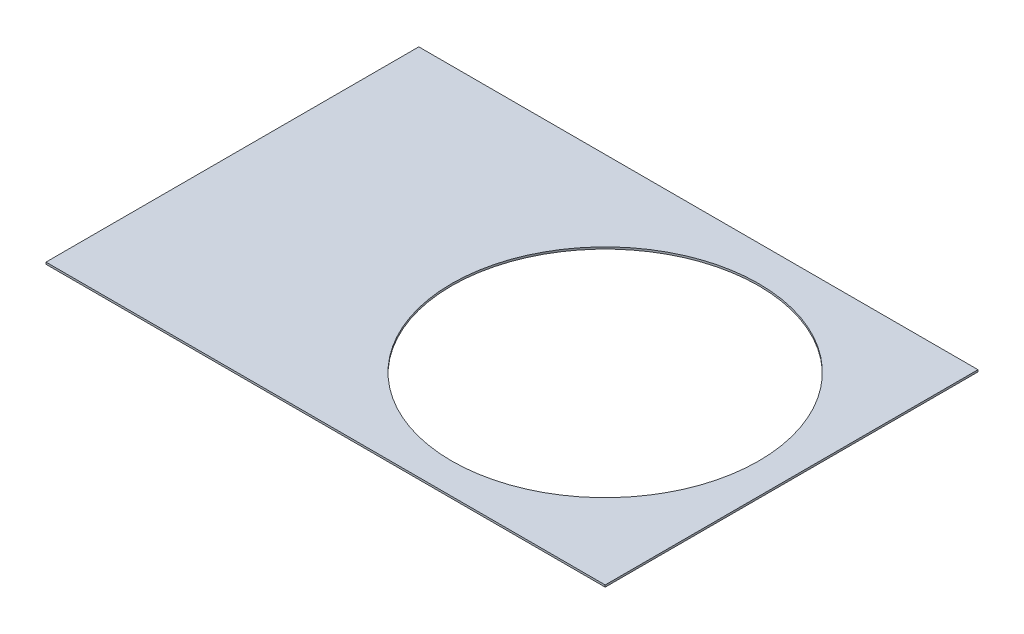
ISO-10303-21;
HEADER;
FILE_DESCRIPTION(('STEP AP214'),'2;1');
FILE_NAME('part.step','',(''),(''),'','','');
FILE_SCHEMA(('AUTOMOTIVE_DESIGN { 1 0 10303 214 1 1 1 1 }'));
ENDSEC;
DATA;
#1=APPLICATION_CONTEXT('core data for automotive mechanical design processes');
#2=APPLICATION_PROTOCOL_DEFINITION('international standard','automotive_design',2000,#1);
#3=PRODUCT_CONTEXT('',#1,'mechanical');
#4=PRODUCT('Part','Part','',(#3));
#5=PRODUCT_RELATED_PRODUCT_CATEGORY('part','',(#4));
#6=PRODUCT_DEFINITION_FORMATION('','',#4);
#7=PRODUCT_DEFINITION_CONTEXT('part definition',#1,'design');
#8=PRODUCT_DEFINITION('design','',#6,#7);
#9=PRODUCT_DEFINITION_SHAPE('','',#8);
#10=(LENGTH_UNIT() NAMED_UNIT(*) SI_UNIT(.MILLI.,.METRE.));
#11=(NAMED_UNIT(*) PLANE_ANGLE_UNIT() SI_UNIT($,.RADIAN.));
#12=(NAMED_UNIT(*) SI_UNIT($,.STERADIAN.) SOLID_ANGLE_UNIT());
#13=UNCERTAINTY_MEASURE_WITH_UNIT(LENGTH_MEASURE(1.E-05),#10,'distance_accuracy_value','');
#14=(GEOMETRIC_REPRESENTATION_CONTEXT(3) GLOBAL_UNCERTAINTY_ASSIGNED_CONTEXT((#13)) GLOBAL_UNIT_ASSIGNED_CONTEXT((#10,
#11,#12)) REPRESENTATION_CONTEXT('',''));
#15=CARTESIAN_POINT('',(0.,0.,0.));
#16=DIRECTION('',(0.,0.,1.));
#17=DIRECTION('',(1.,0.,0.));
#18=AXIS2_PLACEMENT_3D('',#15,#16,#17);
#19=CARTESIAN_POINT('',(0.,3.175,0.));
#20=DIRECTION('',(0.,-1.,0.));
#21=DIRECTION('',(0.,0.,-1.));
#22=AXIS2_PLACEMENT_3D('',#19,#20,#21);
#23=PLANE('',#22);
#24=DIRECTION('',(0.,0.,-1.));
#25=VECTOR('',#24,1.);
#26=CARTESIAN_POINT('',(457.2,3.175,304.8));
#27=LINE('',#26,#25);
#28=CARTESIAN_POINT('',(457.2,3.175,304.8));
#29=VERTEX_POINT('',#28);
#30=CARTESIAN_POINT('',(457.2,3.175,-304.8));
#31=VERTEX_POINT('',#30);
#32=EDGE_CURVE('E90',#29,#31,#27,.T.);
#33=ORIENTED_EDGE('',*,*,#32,.T.);
#34=DIRECTION('',(-1.,0.,0.));
#35=VECTOR('',#34,1.);
#36=CARTESIAN_POINT('',(-457.2,3.175,-304.8));
#37=LINE('',#36,#35);
#38=CARTESIAN_POINT('',(-457.2,3.175,-304.8));
#39=VERTEX_POINT('',#38);
#40=EDGE_CURVE('E85',#31,#39,#37,.T.);
#41=ORIENTED_EDGE('',*,*,#40,.T.);
#42=DIRECTION('',(0.,0.,1.));
#43=VECTOR('',#42,1.);
#44=CARTESIAN_POINT('',(-457.2,3.175,304.8));
#45=LINE('',#44,#43);
#46=CARTESIAN_POINT('',(-457.2,3.175,304.8));
#47=VERTEX_POINT('',#46);
#48=EDGE_CURVE('E88',#39,#47,#45,.T.);
#49=ORIENTED_EDGE('',*,*,#48,.T.);
#50=DIRECTION('',(1.,0.,0.));
#51=VECTOR('',#50,1.);
#52=CARTESIAN_POINT('',(-457.2,3.175,304.8));
#53=LINE('',#52,#51);
#54=EDGE_CURVE('E55',#47,#29,#53,.T.);
#55=ORIENTED_EDGE('',*,*,#54,.T.);
#56=EDGE_LOOP('',(#33,#41,#49,#55));
#57=FACE_BOUND('',#56,.T.);
#58=CARTESIAN_POINT('',(156.049179157244,3.175,3.64917915724428));
#59=DIRECTION('',(0.,1.,0.));
#60=DIRECTION('',(0.,0.,1.));
#61=AXIS2_PLACEMENT_3D('',#58,#59,#60);
#62=CIRCLE('',#61,251.150820842756);
#63=CARTESIAN_POINT('',(156.049179157244,3.175,254.8));
#64=VERTEX_POINT('',#63);
#65=EDGE_CURVE('E105',#64,#64,#62,.T.);
#66=ORIENTED_EDGE('',*,*,#65,.F.);
#67=EDGE_LOOP('',(#66));
#68=FACE_BOUND('',#67,.T.);
#69=ADVANCED_FACE('F38',(#57,#68),#23,.F.);
#70=CARTESIAN_POINT('',(0.,0.,0.));
#71=DIRECTION('',(0.,-1.,0.));
#72=DIRECTION('',(0.,0.,-1.));
#73=AXIS2_PLACEMENT_3D('',#70,#71,#72);
#74=PLANE('',#73);
#75=DIRECTION('',(0.,0.,-1.));
#76=VECTOR('',#75,1.);
#77=CARTESIAN_POINT('',(457.2,0.,304.8));
#78=LINE('',#77,#76);
#79=CARTESIAN_POINT('',(457.2,0.,304.8));
#80=VERTEX_POINT('',#79);
#81=CARTESIAN_POINT('',(457.2,0.,-304.8));
#82=VERTEX_POINT('',#81);
#83=EDGE_CURVE('E102',#80,#82,#78,.T.);
#84=ORIENTED_EDGE('',*,*,#83,.F.);
#85=DIRECTION('',(1.,0.,0.));
#86=VECTOR('',#85,1.);
#87=CARTESIAN_POINT('',(-457.2,0.,304.8));
#88=LINE('',#87,#86);
#89=CARTESIAN_POINT('',(-457.2,0.,304.8));
#90=VERTEX_POINT('',#89);
#91=EDGE_CURVE('E78',#90,#80,#88,.T.);
#92=ORIENTED_EDGE('',*,*,#91,.F.);
#93=DIRECTION('',(0.,0.,1.));
#94=VECTOR('',#93,1.);
#95=CARTESIAN_POINT('',(-457.2,0.,304.8));
#96=LINE('',#95,#94);
#97=CARTESIAN_POINT('',(-457.2,0.,-304.8));
#98=VERTEX_POINT('',#97);
#99=EDGE_CURVE('E72',#98,#90,#96,.T.);
#100=ORIENTED_EDGE('',*,*,#99,.F.);
#101=DIRECTION('',(-1.,0.,0.));
#102=VECTOR('',#101,1.);
#103=CARTESIAN_POINT('',(-457.2,0.,-304.8));
#104=LINE('',#103,#102);
#105=EDGE_CURVE('E94',#82,#98,#104,.T.);
#106=ORIENTED_EDGE('',*,*,#105,.F.);
#107=EDGE_LOOP('',(#84,#92,#100,#106));
#108=FACE_BOUND('',#107,.T.);
#109=CARTESIAN_POINT('',(156.049179157244,0.,3.64917915724428));
#110=DIRECTION('',(0.,1.,0.));
#111=DIRECTION('',(0.,0.,1.));
#112=AXIS2_PLACEMENT_3D('',#109,#110,#111);
#113=CIRCLE('',#112,251.150820842756);
#114=CARTESIAN_POINT('',(156.049179157244,0.,254.8));
#115=VERTEX_POINT('',#114);
#116=EDGE_CURVE('E117',#115,#115,#113,.T.);
#117=ORIENTED_EDGE('',*,*,#116,.T.);
#118=EDGE_LOOP('',(#117));
#119=FACE_BOUND('',#118,.T.);
#120=ADVANCED_FACE('F113',(#108,#119),#74,.T.);
#121=CARTESIAN_POINT('',(457.2,3.175,304.8));
#122=DIRECTION('',(-1.,0.,0.));
#123=DIRECTION('',(0.,0.,1.));
#124=AXIS2_PLACEMENT_3D('',#121,#122,#123);
#125=PLANE('',#124);
#126=ORIENTED_EDGE('',*,*,#83,.T.);
#127=DIRECTION('',(0.,-1.,0.));
#128=VECTOR('',#127,1.);
#129=CARTESIAN_POINT('',(457.2,3.175,-304.8));
#130=LINE('',#129,#128);
#131=EDGE_CURVE('E11',#31,#82,#130,.T.);
#132=ORIENTED_EDGE('',*,*,#131,.F.);
#133=ORIENTED_EDGE('',*,*,#32,.F.);
#134=DIRECTION('',(0.,-1.,0.));
#135=VECTOR('',#134,1.);
#136=CARTESIAN_POINT('',(457.2,3.175,304.8));
#137=LINE('',#136,#135);
#138=EDGE_CURVE('E98',#29,#80,#137,.T.);
#139=ORIENTED_EDGE('',*,*,#138,.T.);
#140=EDGE_LOOP('',(#126,#132,#133,#139));
#141=FACE_BOUND('',#140,.T.);
#142=ADVANCED_FACE('F40',(#141),#125,.F.);
#143=CARTESIAN_POINT('',(-457.2,3.175,-304.8));
#144=DIRECTION('',(0.,0.,1.));
#145=DIRECTION('',(1.,0.,0.));
#146=AXIS2_PLACEMENT_3D('',#143,#144,#145);
#147=PLANE('',#146);
#148=ORIENTED_EDGE('',*,*,#105,.T.);
#149=DIRECTION('',(0.,-1.,0.));
#150=VECTOR('',#149,1.);
#151=CARTESIAN_POINT('',(-457.2,3.175,-304.8));
#152=LINE('',#151,#150);
#153=EDGE_CURVE('E47',#39,#98,#152,.T.);
#154=ORIENTED_EDGE('',*,*,#153,.F.);
#155=ORIENTED_EDGE('',*,*,#40,.F.);
#156=ORIENTED_EDGE('',*,*,#131,.T.);
#157=EDGE_LOOP('',(#148,#154,#155,#156));
#158=FACE_BOUND('',#157,.T.);
#159=ADVANCED_FACE('F93',(#158),#147,.F.);
#160=CARTESIAN_POINT('',(-457.2,3.175,304.8));
#161=DIRECTION('',(1.,0.,0.));
#162=DIRECTION('',(0.,0.,-1.));
#163=AXIS2_PLACEMENT_3D('',#160,#161,#162);
#164=PLANE('',#163);
#165=ORIENTED_EDGE('',*,*,#99,.T.);
#166=DIRECTION('',(0.,-1.,0.));
#167=VECTOR('',#166,1.);
#168=CARTESIAN_POINT('',(-457.2,3.175,304.8));
#169=LINE('',#168,#167);
#170=EDGE_CURVE('E95',#47,#90,#169,.T.);
#171=ORIENTED_EDGE('',*,*,#170,.F.);
#172=ORIENTED_EDGE('',*,*,#48,.F.);
#173=ORIENTED_EDGE('',*,*,#153,.T.);
#174=EDGE_LOOP('',(#165,#171,#172,#173));
#175=FACE_BOUND('',#174,.T.);
#176=ADVANCED_FACE('F96',(#175),#164,.F.);
#177=CARTESIAN_POINT('',(-457.2,3.175,304.8));
#178=DIRECTION('',(0.,0.,-1.));
#179=DIRECTION('',(-1.,0.,0.));
#180=AXIS2_PLACEMENT_3D('',#177,#178,#179);
#181=PLANE('',#180);
#182=ORIENTED_EDGE('',*,*,#91,.T.);
#183=ORIENTED_EDGE('',*,*,#138,.F.);
#184=ORIENTED_EDGE('',*,*,#54,.F.);
#185=ORIENTED_EDGE('',*,*,#170,.T.);
#186=EDGE_LOOP('',(#182,#183,#184,#185));
#187=FACE_BOUND('',#186,.T.);
#188=ADVANCED_FACE('F110',(#187),#181,.F.);
#189=CARTESIAN_POINT('',(156.049179157244,3.175,3.64917915724428));
#190=DIRECTION('',(0.,-1.,0.));
#191=DIRECTION('',(0.,0.,-1.));
#192=AXIS2_PLACEMENT_3D('',#189,#190,#191);
#193=CYLINDRICAL_SURFACE('',#192,251.150820842756);
#194=ORIENTED_EDGE('',*,*,#65,.T.);
#195=EDGE_LOOP('',(#194));
#196=FACE_BOUND('',#195,.T.);
#197=ORIENTED_EDGE('',*,*,#116,.F.);
#198=EDGE_LOOP('',(#197));
#199=FACE_BOUND('',#198,.T.);
#200=ADVANCED_FACE('F123',(#196,#199),#193,.F.);
#201=CLOSED_SHELL('',(#69,#120,#142,#159,#176,#188,#200));
#202=MANIFOLD_SOLID_BREP('B2',#201);
#203=ADVANCED_BREP_SHAPE_REPRESENTATION('',(#18,#202),#14);
#204=SHAPE_DEFINITION_REPRESENTATION(#9,#203);
ENDSEC;
END-ISO-10303-21;
